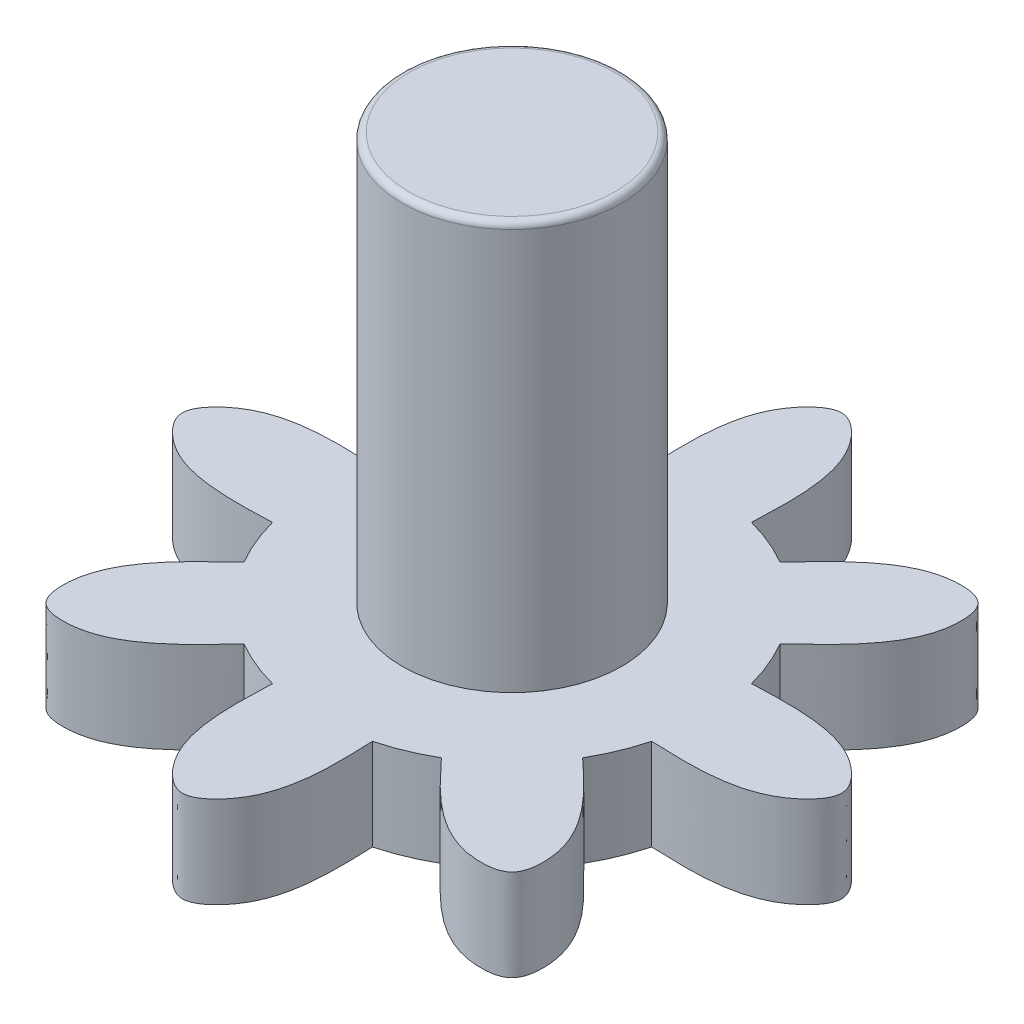
ISO-10303-21;
HEADER;
FILE_DESCRIPTION(('STEP AP214'),'2;1');
FILE_NAME('part.step','',(''),(''),'','','');
FILE_SCHEMA(('AUTOMOTIVE_DESIGN { 1 0 10303 214 1 1 1 1 }'));
ENDSEC;
DATA;
#1=APPLICATION_CONTEXT('core data for automotive mechanical design processes');
#2=APPLICATION_PROTOCOL_DEFINITION('international standard','automotive_design',2000,#1);
#3=PRODUCT_CONTEXT('',#1,'mechanical');
#4=PRODUCT('Part','Part','',(#3));
#5=PRODUCT_RELATED_PRODUCT_CATEGORY('part','',(#4));
#6=PRODUCT_DEFINITION_FORMATION('','',#4);
#7=PRODUCT_DEFINITION_CONTEXT('part definition',#1,'design');
#8=PRODUCT_DEFINITION('design','',#6,#7);
#9=PRODUCT_DEFINITION_SHAPE('','',#8);
#10=(LENGTH_UNIT() NAMED_UNIT(*) SI_UNIT(.MILLI.,.METRE.));
#11=(NAMED_UNIT(*) PLANE_ANGLE_UNIT() SI_UNIT($,.RADIAN.));
#12=(NAMED_UNIT(*) SI_UNIT($,.STERADIAN.) SOLID_ANGLE_UNIT());
#13=UNCERTAINTY_MEASURE_WITH_UNIT(LENGTH_MEASURE(1.E-05),#10,'distance_accuracy_value','');
#14=(GEOMETRIC_REPRESENTATION_CONTEXT(3) GLOBAL_UNCERTAINTY_ASSIGNED_CONTEXT((#13)) GLOBAL_UNIT_ASSIGNED_CONTEXT((#10,
#11,#12)) REPRESENTATION_CONTEXT('',''));
#15=CARTESIAN_POINT('',(0.,0.,0.));
#16=DIRECTION('',(0.,0.,1.));
#17=DIRECTION('',(1.,0.,0.));
#18=AXIS2_PLACEMENT_3D('',#15,#16,#17);
#19=CARTESIAN_POINT('',(0.,2.75,0.));
#20=DIRECTION('',(0.,-1.,0.));
#21=DIRECTION('',(0.,0.,-1.));
#22=AXIS2_PLACEMENT_3D('',#19,#20,#21);
#23=CYLINDRICAL_SURFACE('',#22,5.89);
#24=DIRECTION('',(0.,-1.,0.));
#25=VECTOR('',#24,1.);
#26=CARTESIAN_POINT('',(5.08831548219907,2.75,-2.96667247157707));
#27=LINE('',#26,#25);
#28=CARTESIAN_POINT('',(5.08831548219908,2.75,-2.96667247157706));
#29=VERTEX_POINT('',#28);
#30=CARTESIAN_POINT('',(5.08831548219908,0.,-2.96667247157706));
#31=VERTEX_POINT('',#30);
#32=EDGE_CURVE('E63',#29,#31,#27,.T.);
#33=ORIENTED_EDGE('',*,*,#32,.F.);
#34=CARTESIAN_POINT('',(0.,2.75,0.));
#35=DIRECTION('',(0.,1.,0.));
#36=DIRECTION('',(0.,0.,1.));
#37=AXIS2_PLACEMENT_3D('',#34,#35,#36);
#38=CIRCLE('',#37,5.89);
#39=CARTESIAN_POINT('',(5.69573660449103,2.75,-1.50022816006798));
#40=VERTEX_POINT('',#39);
#41=EDGE_CURVE('E399',#40,#29,#38,.T.);
#42=ORIENTED_EDGE('',*,*,#41,.F.);
#43=DIRECTION('',(0.,-1.,0.));
#44=VECTOR('',#43,1.);
#45=CARTESIAN_POINT('',(5.69573660449103,2.75,-1.50022816006798));
#46=LINE('',#45,#44);
#47=CARTESIAN_POINT('',(5.69573660449103,0.,-1.50022816006798));
#48=VERTEX_POINT('',#47);
#49=EDGE_CURVE('E192',#48,#40,#46,.F.);
#50=ORIENTED_EDGE('',*,*,#49,.F.);
#51=CARTESIAN_POINT('',(0.,0.,0.));
#52=DIRECTION('',(0.,1.,0.));
#53=DIRECTION('',(0.,0.,1.));
#54=AXIS2_PLACEMENT_3D('',#51,#52,#53);
#55=CIRCLE('',#54,5.89);
#56=EDGE_CURVE('E161',#48,#31,#55,.T.);
#57=ORIENTED_EDGE('',*,*,#56,.T.);
#58=EDGE_LOOP('',(#33,#42,#50,#57));
#59=FACE_BOUND('',#58,.T.);
#60=ADVANCED_FACE('F40',(#59),#23,.T.);
#61=DIRECTION('',(0.,-1.,0.));
#62=VECTOR('',#61,1.);
#63=CARTESIAN_POINT('',(2.96667247157695,2.75,-5.08831548219914));
#64=LINE('',#63,#62);
#65=CARTESIAN_POINT('',(2.96667247157695,0.,-5.08831548219914));
#66=VERTEX_POINT('',#65);
#67=CARTESIAN_POINT('',(2.96667247157695,2.75,-5.08831548219914));
#68=VERTEX_POINT('',#67);
#69=EDGE_CURVE('E165',#66,#68,#64,.F.);
#70=ORIENTED_EDGE('',*,*,#69,.F.);
#71=CARTESIAN_POINT('',(1.50022816006792,0.,-5.69573660449105));
#72=VERTEX_POINT('',#71);
#73=EDGE_CURVE('E154',#66,#72,#55,.T.);
#74=ORIENTED_EDGE('',*,*,#73,.T.);
#75=DIRECTION('',(0.,-1.,0.));
#76=VECTOR('',#75,1.);
#77=CARTESIAN_POINT('',(1.50022816006792,2.75,-5.69573660449105));
#78=LINE('',#77,#76);
#79=CARTESIAN_POINT('',(1.50022816006792,2.75,-5.69573660449105));
#80=VERTEX_POINT('',#79);
#81=EDGE_CURVE('E162',#80,#72,#78,.T.);
#82=ORIENTED_EDGE('',*,*,#81,.F.);
#83=EDGE_CURVE('E55',#68,#80,#38,.T.);
#84=ORIENTED_EDGE('',*,*,#83,.F.);
#85=EDGE_LOOP('',(#70,#74,#82,#84));
#86=FACE_BOUND('',#85,.T.);
#87=ADVANCED_FACE('F166',(#86),#23,.T.);
#88=DIRECTION('',(0.,-1.,0.));
#89=VECTOR('',#88,1.);
#90=CARTESIAN_POINT('',(5.69573660449106,2.75,1.50022816006786));
#91=LINE('',#90,#89);
#92=CARTESIAN_POINT('',(5.69573660449106,2.75,1.50022816006786));
#93=VERTEX_POINT('',#92);
#94=CARTESIAN_POINT('',(5.69573660449106,0.,1.50022816006786));
#95=VERTEX_POINT('',#94);
#96=EDGE_CURVE('E222',#93,#95,#91,.T.);
#97=ORIENTED_EDGE('',*,*,#96,.F.);
#98=CARTESIAN_POINT('',(5.08831548219913,2.75,2.96667247157697));
#99=VERTEX_POINT('',#98);
#100=EDGE_CURVE('E390',#99,#93,#38,.T.);
#101=ORIENTED_EDGE('',*,*,#100,.F.);
#102=DIRECTION('',(0.,-1.,0.));
#103=VECTOR('',#102,1.);
#104=CARTESIAN_POINT('',(5.08831548219913,2.75,2.96667247157697));
#105=LINE('',#104,#103);
#106=CARTESIAN_POINT('',(5.08831548219914,0.,2.96667247157697));
#107=VERTEX_POINT('',#106);
#108=EDGE_CURVE('E220',#107,#99,#105,.F.);
#109=ORIENTED_EDGE('',*,*,#108,.F.);
#110=EDGE_CURVE('E391',#107,#95,#55,.T.);
#111=ORIENTED_EDGE('',*,*,#110,.T.);
#112=EDGE_LOOP('',(#97,#101,#109,#111));
#113=FACE_BOUND('',#112,.T.);
#114=ADVANCED_FACE('F376',(#113),#23,.T.);
#115=DIRECTION('',(0.,-1.,0.));
#116=VECTOR('',#115,1.);
#117=CARTESIAN_POINT('',(2.96667247157706,2.75,5.08831548219908));
#118=LINE('',#117,#116);
#119=CARTESIAN_POINT('',(2.96667247157704,2.75,5.08831548219909));
#120=VERTEX_POINT('',#119);
#121=CARTESIAN_POINT('',(2.96667247157704,0.,5.08831548219909));
#122=VERTEX_POINT('',#121);
#123=EDGE_CURVE('E235',#120,#122,#118,.T.);
#124=ORIENTED_EDGE('',*,*,#123,.F.);
#125=CARTESIAN_POINT('',(1.50022816006792,2.75,5.69573660449105));
#126=VERTEX_POINT('',#125);
#127=EDGE_CURVE('E398',#126,#120,#38,.T.);
#128=ORIENTED_EDGE('',*,*,#127,.F.);
#129=DIRECTION('',(0.,-1.,0.));
#130=VECTOR('',#129,1.);
#131=CARTESIAN_POINT('',(1.50022816006792,2.75,5.69573660449105));
#132=LINE('',#131,#130);
#133=CARTESIAN_POINT('',(1.50022816006792,0.,5.69573660449105));
#134=VERTEX_POINT('',#133);
#135=EDGE_CURVE('E244',#134,#126,#132,.F.);
#136=ORIENTED_EDGE('',*,*,#135,.F.);
#137=EDGE_CURVE('E451',#134,#122,#55,.T.);
#138=ORIENTED_EDGE('',*,*,#137,.T.);
#139=EDGE_LOOP('',(#124,#128,#136,#138));
#140=FACE_BOUND('',#139,.T.);
#141=ADVANCED_FACE('F380',(#140),#23,.T.);
#142=DIRECTION('',(0.,-1.,0.));
#143=VECTOR('',#142,1.);
#144=CARTESIAN_POINT('',(-1.50022816006792,2.75,5.69573660449105));
#145=LINE('',#144,#143);
#146=CARTESIAN_POINT('',(-1.50022816006792,2.75,5.69573660449105));
#147=VERTEX_POINT('',#146);
#148=CARTESIAN_POINT('',(-1.50022816006792,0.,5.69573660449105));
#149=VERTEX_POINT('',#148);
#150=EDGE_CURVE('E257',#147,#149,#145,.T.);
#151=ORIENTED_EDGE('',*,*,#150,.F.);
#152=CARTESIAN_POINT('',(-2.96667247157699,2.75,5.08831548219912));
#153=VERTEX_POINT('',#152);
#154=EDGE_CURVE('E444',#153,#147,#38,.T.);
#155=ORIENTED_EDGE('',*,*,#154,.F.);
#156=DIRECTION('',(0.,-1.,0.));
#157=VECTOR('',#156,1.);
#158=CARTESIAN_POINT('',(-2.96667247157699,2.75,5.08831548219912));
#159=LINE('',#158,#157);
#160=CARTESIAN_POINT('',(-2.96667247157699,0.,5.08831548219912));
#161=VERTEX_POINT('',#160);
#162=EDGE_CURVE('E267',#161,#153,#159,.F.);
#163=ORIENTED_EDGE('',*,*,#162,.F.);
#164=EDGE_CURVE('E452',#161,#149,#55,.T.);
#165=ORIENTED_EDGE('',*,*,#164,.T.);
#166=EDGE_LOOP('',(#151,#155,#163,#165));
#167=FACE_BOUND('',#166,.T.);
#168=ADVANCED_FACE('F385',(#167),#23,.T.);
#169=DIRECTION('',(0.,-1.,0.));
#170=VECTOR('',#169,1.);
#171=CARTESIAN_POINT('',(-5.08831548219909,2.75,2.96667247157704));
#172=LINE('',#171,#170);
#173=CARTESIAN_POINT('',(-5.0883154821991,2.75,2.96667247157702));
#174=VERTEX_POINT('',#173);
#175=CARTESIAN_POINT('',(-5.0883154821991,0.,2.96667247157702));
#176=VERTEX_POINT('',#175);
#177=EDGE_CURVE('E295',#174,#176,#172,.T.);
#178=ORIENTED_EDGE('',*,*,#177,.F.);
#179=CARTESIAN_POINT('',(-5.69573660449104,2.75,1.50022816006794));
#180=VERTEX_POINT('',#179);
#181=EDGE_CURVE('E442',#180,#174,#38,.T.);
#182=ORIENTED_EDGE('',*,*,#181,.F.);
#183=DIRECTION('',(0.,-1.,0.));
#184=VECTOR('',#183,1.);
#185=CARTESIAN_POINT('',(-5.69573660449104,2.75,1.50022816006794));
#186=LINE('',#185,#184);
#187=CARTESIAN_POINT('',(-5.69573660449104,0.,1.50022816006794));
#188=VERTEX_POINT('',#187);
#189=EDGE_CURVE('E293',#188,#180,#186,.F.);
#190=ORIENTED_EDGE('',*,*,#189,.F.);
#191=EDGE_CURVE('E441',#188,#176,#55,.T.);
#192=ORIENTED_EDGE('',*,*,#191,.T.);
#193=EDGE_LOOP('',(#178,#182,#190,#192));
#194=FACE_BOUND('',#193,.T.);
#195=ADVANCED_FACE('F370',(#194),#23,.T.);
#196=DIRECTION('',(0.,-1.,0.));
#197=VECTOR('',#196,1.);
#198=CARTESIAN_POINT('',(-5.69573660449105,2.75,-1.5002281600679));
#199=LINE('',#198,#197);
#200=CARTESIAN_POINT('',(-5.69573660449105,2.75,-1.50022816006793));
#201=VERTEX_POINT('',#200);
#202=CARTESIAN_POINT('',(-5.69573660449105,0.,-1.50022816006793));
#203=VERTEX_POINT('',#202);
#204=EDGE_CURVE('E308',#201,#203,#199,.T.);
#205=ORIENTED_EDGE('',*,*,#204,.F.);
#206=CARTESIAN_POINT('',(-5.08831548219911,2.75,-2.96667247157701));
#207=VERTEX_POINT('',#206);
#208=EDGE_CURVE('E405',#207,#201,#38,.T.);
#209=ORIENTED_EDGE('',*,*,#208,.F.);
#210=DIRECTION('',(0.,-1.,0.));
#211=VECTOR('',#210,1.);
#212=CARTESIAN_POINT('',(-5.08831548219911,2.75,-2.96667247157701));
#213=LINE('',#212,#211);
#214=CARTESIAN_POINT('',(-5.08831548219911,0.,-2.96667247157701));
#215=VERTEX_POINT('',#214);
#216=EDGE_CURVE('E317',#215,#207,#213,.F.);
#217=ORIENTED_EDGE('',*,*,#216,.F.);
#218=EDGE_CURVE('E406',#215,#203,#55,.T.);
#219=ORIENTED_EDGE('',*,*,#218,.T.);
#220=EDGE_LOOP('',(#205,#209,#217,#219));
#221=FACE_BOUND('',#220,.T.);
#222=ADVANCED_FACE('F364',(#221),#23,.T.);
#223=DIRECTION('',(0.,-1.,0.));
#224=VECTOR('',#223,1.);
#225=CARTESIAN_POINT('',(-2.96667247157702,2.75,-5.0883154821991));
#226=LINE('',#225,#224);
#227=CARTESIAN_POINT('',(-2.96667247157702,2.75,-5.0883154821991));
#228=VERTEX_POINT('',#227);
#229=CARTESIAN_POINT('',(-2.96667247157702,0.,-5.0883154821991));
#230=VERTEX_POINT('',#229);
#231=EDGE_CURVE('E330',#228,#230,#226,.T.);
#232=ORIENTED_EDGE('',*,*,#231,.F.);
#233=CARTESIAN_POINT('',(-1.50022816006792,2.75,-5.69573660449105));
#234=VERTEX_POINT('',#233);
#235=EDGE_CURVE('E336',#234,#228,#38,.T.);
#236=ORIENTED_EDGE('',*,*,#235,.F.);
#237=DIRECTION('',(0.,-1.,0.));
#238=VECTOR('',#237,1.);
#239=CARTESIAN_POINT('',(-1.50022816006792,2.75,-5.69573660449105));
#240=LINE('',#239,#238);
#241=CARTESIAN_POINT('',(-1.50022816006792,0.,-5.69573660449105));
#242=VERTEX_POINT('',#241);
#243=EDGE_CURVE('E343',#242,#234,#240,.F.);
#244=ORIENTED_EDGE('',*,*,#243,.F.);
#245=EDGE_CURVE('E164',#242,#230,#55,.T.);
#246=ORIENTED_EDGE('',*,*,#245,.T.);
#247=EDGE_LOOP('',(#232,#236,#244,#246));
#248=FACE_BOUND('',#247,.T.);
#249=ADVANCED_FACE('F360',(#248),#23,.T.);
#250=CARTESIAN_POINT('',(0.,2.75,0.));
#251=DIRECTION('',(0.,1.,0.));
#252=DIRECTION('',(0.,0.,1.));
#253=AXIS2_PLACEMENT_3D('',#250,#251,#252);
#254=PLANE('',#253);
#255=ORIENTED_EDGE('',*,*,#41,.T.);
#256=CARTESIAN_POINT('',(5.08409775673124,2.75,-2.9627774131717));
#257=CARTESIAN_POINT('',(5.49968944174929,2.75,-3.34657489327147));
#258=CARTESIAN_POINT('',(6.46693464253058,2.75,-4.23982248238612));
#259=CARTESIAN_POINT('',(7.33984910029191,2.75,-5.64560569758025));
#260=CARTESIAN_POINT('',(7.13398158934485,2.75,-7.13398158934502));
#261=CARTESIAN_POINT('',(5.64560569758007,2.75,-7.33984910029205));
#262=CARTESIAN_POINT('',(4.23982248238596,2.75,-6.46693464253068));
#263=CARTESIAN_POINT('',(3.34657489327134,2.75,-5.49968944174937));
#264=CARTESIAN_POINT('',(2.96277741317157,2.75,-5.08409775673131));
#265=B_SPLINE_CURVE_WITH_KNOTS('',3,(#256,#257,#258,#259,#260,#261,#262,#263,#264),
.UNSPECIFIED.,.F.,.F.,(4,1,1,1,1,1,4),(0.,0.178466674419104,0.415362098314794,0.5,
0.584637901685206,0.821533325580896,1.),.UNSPECIFIED.);
#266=EDGE_CURVE('E170',#29,#68,#265,.T.);
#267=ORIENTED_EDGE('',*,*,#266,.T.);
#268=ORIENTED_EDGE('',*,*,#83,.T.);
#269=CARTESIAN_POINT('',(1.5,2.75,-5.69));
#270=CARTESIAN_POINT('',(1.52248189790015,2.75,-6.25525349946186));
#271=CARTESIAN_POINT('',(1.57480611090126,2.75,-7.57082056754596));
#272=CARTESIAN_POINT('',(1.1980109990381,2.75,-9.18210314436678));
#273=CARTESIAN_POINT('',(0.,2.75,-10.0889735173716));
#274=CARTESIAN_POINT('',(-1.1980109990381,2.75,-9.18210314436678));
#275=CARTESIAN_POINT('',(-1.57480611090126,2.75,-7.57082056754596));
#276=CARTESIAN_POINT('',(-1.52248189790015,2.75,-6.25525349946186));
#277=CARTESIAN_POINT('',(-1.5,2.75,-5.69));
#278=B_SPLINE_CURVE_WITH_KNOTS('',3,(#269,#270,#271,#272,#273,#274,#275,#276,#277),
.UNSPECIFIED.,.F.,.F.,(4,1,1,1,1,1,4),(0.,0.178466674419104,0.415362098314794,0.5,
0.584637901685206,0.821533325580896,1.),.UNSPECIFIED.);
#279=EDGE_CURVE('E337',#80,#234,#278,.T.);
#280=ORIENTED_EDGE('',*,*,#279,.T.);
#281=ORIENTED_EDGE('',*,*,#235,.T.);
#282=CARTESIAN_POINT('',(-2.96277741317164,2.75,-5.08409775673127));
#283=CARTESIAN_POINT('',(-3.34657489327141,2.75,-5.49968944174932));
#284=CARTESIAN_POINT('',(-4.23982248238605,2.75,-6.46693464253062));
#285=CARTESIAN_POINT('',(-5.64560569758017,2.75,-7.33984910029197));
#286=CARTESIAN_POINT('',(-7.13398158934495,2.75,-7.13398158934492));
#287=CARTESIAN_POINT('',(-7.33984910029199,2.75,-5.64560569758015));
#288=CARTESIAN_POINT('',(-6.46693464253064,2.75,-4.23982248238602));
#289=CARTESIAN_POINT('',(-5.49968944174933,2.75,-3.3465748932714));
#290=CARTESIAN_POINT('',(-5.08409775673128,2.75,-2.96277741317162));
#291=B_SPLINE_CURVE_WITH_KNOTS('',3,(#282,#283,#284,#285,#286,#287,#288,#289,#290),
.UNSPECIFIED.,.F.,.F.,(4,1,1,1,1,1,4),(0.,0.178466674419104,0.415362098314794,0.5,
0.584637901685206,0.821533325580896,1.),.UNSPECIFIED.);
#292=EDGE_CURVE('E311',#228,#207,#291,.T.);
#293=ORIENTED_EDGE('',*,*,#292,.T.);
#294=ORIENTED_EDGE('',*,*,#208,.T.);
#295=CARTESIAN_POINT('',(-5.69,2.75,-1.49999999999998));
#296=CARTESIAN_POINT('',(-6.25525349946187,2.75,-1.52248189790013));
#297=CARTESIAN_POINT('',(-7.57082056754597,2.75,-1.57480611090124));
#298=CARTESIAN_POINT('',(-9.18210314436678,2.75,-1.19801099903807));
#299=CARTESIAN_POINT('',(-10.0889735173716,2.75,0.));
#300=CARTESIAN_POINT('',(-9.18210314436678,2.75,1.19801099903813));
#301=CARTESIAN_POINT('',(-7.57082056754595,2.75,1.57480611090129));
#302=CARTESIAN_POINT('',(-6.25525349946186,2.75,1.52248189790017));
#303=CARTESIAN_POINT('',(-5.68999999999999,2.75,1.50000000000002));
#304=B_SPLINE_CURVE_WITH_KNOTS('',3,(#295,#296,#297,#298,#299,#300,#301,#302,#303),
.UNSPECIFIED.,.F.,.F.,(4,1,1,1,1,1,4),(0.,0.178466674419104,0.415362098314794,0.5,
0.584637901685206,0.821533325580896,1.),.UNSPECIFIED.);
#305=EDGE_CURVE('E286',#201,#180,#304,.T.);
#306=ORIENTED_EDGE('',*,*,#305,.T.);
#307=ORIENTED_EDGE('',*,*,#181,.T.);
#308=CARTESIAN_POINT('',(-5.08409775673126,2.75,2.96277741317166));
#309=CARTESIAN_POINT('',(-5.49968944174931,2.75,3.34657489327143));
#310=CARTESIAN_POINT('',(-6.46693464253061,2.75,4.23982248238607));
#311=CARTESIAN_POINT('',(-7.33984910029195,2.75,5.6456056975802));
#312=CARTESIAN_POINT('',(-7.1339815893449,2.75,7.13398158934497));
#313=CARTESIAN_POINT('',(-5.64560569758012,2.75,7.33984910029201));
#314=CARTESIAN_POINT('',(-4.239822482386,2.75,6.46693464253065));
#315=CARTESIAN_POINT('',(-3.34657489327138,2.75,5.49968944174934));
#316=CARTESIAN_POINT('',(-2.96277741317161,2.75,5.08409775673129));
#317=B_SPLINE_CURVE_WITH_KNOTS('',3,(#308,#309,#310,#311,#312,#313,#314,#315,#316),
.UNSPECIFIED.,.F.,.F.,(4,1,1,1,1,1,4),(0.,0.178466674419104,0.415362098314794,0.5,
0.584637901685206,0.821533325580896,1.),.UNSPECIFIED.);
#318=EDGE_CURVE('E261',#174,#153,#317,.T.);
#319=ORIENTED_EDGE('',*,*,#318,.T.);
#320=ORIENTED_EDGE('',*,*,#154,.T.);
#321=CARTESIAN_POINT('',(-1.5,2.75,5.69));
#322=CARTESIAN_POINT('',(-1.52248189790015,2.75,6.25525349946186));
#323=CARTESIAN_POINT('',(-1.57480611090126,2.75,7.57082056754596));
#324=CARTESIAN_POINT('',(-1.1980109990381,2.75,9.18210314436678));
#325=CARTESIAN_POINT('',(0.,2.75,10.0889735173716));
#326=CARTESIAN_POINT('',(1.1980109990381,2.75,9.18210314436678));
#327=CARTESIAN_POINT('',(1.57480611090126,2.75,7.57082056754596));
#328=CARTESIAN_POINT('',(1.52248189790015,2.75,6.25525349946186));
#329=CARTESIAN_POINT('',(1.5,2.75,5.69));
#330=B_SPLINE_CURVE_WITH_KNOTS('',3,(#321,#322,#323,#324,#325,#326,#327,#328,#329),
.UNSPECIFIED.,.F.,.F.,(4,1,1,1,1,1,4),(0.,0.178466674419104,0.415362098314794,0.5,
0.584637901685206,0.821533325580896,1.),.UNSPECIFIED.);
#331=EDGE_CURVE('E238',#147,#126,#330,.T.);
#332=ORIENTED_EDGE('',*,*,#331,.T.);
#333=ORIENTED_EDGE('',*,*,#127,.T.);
#334=CARTESIAN_POINT('',(2.96277741317168,2.75,5.08409775673125));
#335=CARTESIAN_POINT('',(3.34657489327145,2.75,5.4996894417493));
#336=CARTESIAN_POINT('',(4.2398224823861,2.75,6.46693464253059));
#337=CARTESIAN_POINT('',(5.64560569758023,2.75,7.33984910029193));
#338=CARTESIAN_POINT('',(7.133981589345,2.75,7.13398158934487));
#339=CARTESIAN_POINT('',(7.33984910029203,2.75,5.6456056975801));
#340=CARTESIAN_POINT('',(6.46693464253066,2.75,4.23982248238598));
#341=CARTESIAN_POINT('',(5.49968944174936,2.75,3.34657489327136));
#342=CARTESIAN_POINT('',(5.0840977567313,2.75,2.96277741317159));
#343=B_SPLINE_CURVE_WITH_KNOTS('',3,(#334,#335,#336,#337,#338,#339,#340,#341,#342),
.UNSPECIFIED.,.F.,.F.,(4,1,1,1,1,1,4),(0.,0.178466674419104,0.415362098314794,0.5,
0.584637901685206,0.821533325580896,1.),.UNSPECIFIED.);
#344=EDGE_CURVE('E213',#120,#99,#343,.T.);
#345=ORIENTED_EDGE('',*,*,#344,.T.);
#346=ORIENTED_EDGE('',*,*,#100,.T.);
#347=CARTESIAN_POINT('',(5.69000000000001,2.75,1.49999999999994));
#348=CARTESIAN_POINT('',(6.25525349946188,2.75,1.52248189790008));
#349=CARTESIAN_POINT('',(7.57082056754598,2.75,1.57480611090118));
#350=CARTESIAN_POINT('',(9.18210314436679,2.75,1.198010999038));
#351=CARTESIAN_POINT('',(10.0889735173716,2.75,-1.05856411486558E-13));
#352=CARTESIAN_POINT('',(9.18210314436677,2.75,-1.1980109990382));
#353=CARTESIAN_POINT('',(7.57082056754594,2.75,-1.57480611090134));
#354=CARTESIAN_POINT('',(6.25525349946185,2.75,-1.52248189790022));
#355=CARTESIAN_POINT('',(5.68999999999998,2.75,-1.50000000000006));
#356=B_SPLINE_CURVE_WITH_KNOTS('',3,(#347,#348,#349,#350,#351,#352,#353,#354,#355),
.UNSPECIFIED.,.F.,.F.,(4,1,1,1,1,1,4),(0.,0.178466674419104,0.415362098314794,0.5,
0.584637901685206,0.821533325580896,1.),.UNSPECIFIED.);
#357=EDGE_CURVE('E186',#93,#40,#356,.T.);
#358=ORIENTED_EDGE('',*,*,#357,.T.);
#359=EDGE_LOOP('',(#255,#267,#268,#280,#281,#293,#294,#306,#307,#319,#320,#332,#333,#345,#346,#358));
#360=FACE_BOUND('',#359,.T.);
#361=CARTESIAN_POINT('',(0.,2.75,0.));
#362=DIRECTION('',(0.,1.,0.));
#363=DIRECTION('',(0.,0.,1.));
#364=AXIS2_PLACEMENT_3D('',#361,#362,#363);
#365=CIRCLE('',#364,3.3);
#366=CARTESIAN_POINT('',(0.,2.75,3.3));
#367=VERTEX_POINT('',#366);
#368=EDGE_CURVE('E333',#367,#367,#365,.T.);
#369=ORIENTED_EDGE('',*,*,#368,.F.);
#370=EDGE_LOOP('',(#369));
#371=FACE_BOUND('',#370,.T.);
#372=ADVANCED_FACE('F357',(#360,#371),#254,.T.);
#373=CARTESIAN_POINT('',(0.,0.,0.));
#374=DIRECTION('',(0.,1.,0.));
#375=DIRECTION('',(0.,0.,1.));
#376=AXIS2_PLACEMENT_3D('',#373,#374,#375);
#377=PLANE('',#376);
#378=ORIENTED_EDGE('',*,*,#73,.F.);
#379=CARTESIAN_POINT('',(5.08409775673124,0.,-2.9627774131717));
#380=CARTESIAN_POINT('',(5.49968944174929,0.,-3.34657489327147));
#381=CARTESIAN_POINT('',(6.46693464253058,0.,-4.23982248238612));
#382=CARTESIAN_POINT('',(7.33984910029191,0.,-5.64560569758025));
#383=CARTESIAN_POINT('',(7.13398158934485,0.,-7.13398158934502));
#384=CARTESIAN_POINT('',(5.64560569758007,0.,-7.33984910029205));
#385=CARTESIAN_POINT('',(4.23982248238596,0.,-6.46693464253068));
#386=CARTESIAN_POINT('',(3.34657489327134,0.,-5.49968944174937));
#387=CARTESIAN_POINT('',(2.96277741317157,0.,-5.08409775673131));
#388=B_SPLINE_CURVE_WITH_KNOTS('',3,(#379,#380,#381,#382,#383,#384,#385,#386,#387),
.UNSPECIFIED.,.F.,.F.,(4,1,1,1,1,1,4),(0.,0.178466674419104,0.415362098314794,0.5,
0.584637901685206,0.821533325580896,1.),.UNSPECIFIED.);
#389=EDGE_CURVE('E157',#31,#66,#388,.T.);
#390=ORIENTED_EDGE('',*,*,#389,.F.);
#391=ORIENTED_EDGE('',*,*,#56,.F.);
#392=CARTESIAN_POINT('',(5.69000000000001,0.,1.49999999999994));
#393=CARTESIAN_POINT('',(6.25525349946188,0.,1.52248189790008));
#394=CARTESIAN_POINT('',(7.57082056754598,0.,1.57480611090118));
#395=CARTESIAN_POINT('',(9.18210314436679,0.,1.198010999038));
#396=CARTESIAN_POINT('',(10.0889735173716,0.,-1.05856411486558E-13));
#397=CARTESIAN_POINT('',(9.18210314436677,0.,-1.1980109990382));
#398=CARTESIAN_POINT('',(7.57082056754594,0.,-1.57480611090134));
#399=CARTESIAN_POINT('',(6.25525349946185,0.,-1.52248189790022));
#400=CARTESIAN_POINT('',(5.68999999999998,0.,-1.50000000000006));
#401=B_SPLINE_CURVE_WITH_KNOTS('',3,(#392,#393,#394,#395,#396,#397,#398,#399,#400),
.UNSPECIFIED.,.F.,.F.,(4,1,1,1,1,1,4),(0.,0.178466674419104,0.415362098314794,0.5,
0.584637901685206,0.821533325580896,1.),.UNSPECIFIED.);
#402=EDGE_CURVE('E185',#95,#48,#401,.T.);
#403=ORIENTED_EDGE('',*,*,#402,.F.);
#404=ORIENTED_EDGE('',*,*,#110,.F.);
#405=CARTESIAN_POINT('',(2.96277741317168,0.,5.08409775673125));
#406=CARTESIAN_POINT('',(3.34657489327145,0.,5.4996894417493));
#407=CARTESIAN_POINT('',(4.2398224823861,0.,6.46693464253059));
#408=CARTESIAN_POINT('',(5.64560569758023,0.,7.33984910029193));
#409=CARTESIAN_POINT('',(7.133981589345,0.,7.13398158934487));
#410=CARTESIAN_POINT('',(7.33984910029203,0.,5.6456056975801));
#411=CARTESIAN_POINT('',(6.46693464253066,0.,4.23982248238598));
#412=CARTESIAN_POINT('',(5.49968944174936,0.,3.34657489327136));
#413=CARTESIAN_POINT('',(5.0840977567313,0.,2.96277741317159));
#414=B_SPLINE_CURVE_WITH_KNOTS('',3,(#405,#406,#407,#408,#409,#410,#411,#412,#413),
.UNSPECIFIED.,.F.,.F.,(4,1,1,1,1,1,4),(0.,0.178466674419104,0.415362098314794,0.5,
0.584637901685206,0.821533325580896,1.),.UNSPECIFIED.);
#415=EDGE_CURVE('E221',#122,#107,#414,.T.);
#416=ORIENTED_EDGE('',*,*,#415,.F.);
#417=ORIENTED_EDGE('',*,*,#137,.F.);
#418=CARTESIAN_POINT('',(-1.5,0.,5.69));
#419=CARTESIAN_POINT('',(-1.52248189790015,0.,6.25525349946186));
#420=CARTESIAN_POINT('',(-1.57480611090126,0.,7.57082056754596));
#421=CARTESIAN_POINT('',(-1.1980109990381,0.,9.18210314436678));
#422=CARTESIAN_POINT('',(0.,0.,10.0889735173716));
#423=CARTESIAN_POINT('',(1.1980109990381,0.,9.18210314436678));
#424=CARTESIAN_POINT('',(1.57480611090126,0.,7.57082056754596));
#425=CARTESIAN_POINT('',(1.52248189790015,0.,6.25525349946186));
#426=CARTESIAN_POINT('',(1.5,0.,5.69));
#427=B_SPLINE_CURVE_WITH_KNOTS('',3,(#418,#419,#420,#421,#422,#423,#424,#425,#426),
.UNSPECIFIED.,.F.,.F.,(4,1,1,1,1,1,4),(0.,0.178466674419104,0.415362098314794,0.5,
0.584637901685206,0.821533325580896,1.),.UNSPECIFIED.);
#428=EDGE_CURVE('E237',#149,#134,#427,.T.);
#429=ORIENTED_EDGE('',*,*,#428,.F.);
#430=ORIENTED_EDGE('',*,*,#164,.F.);
#431=CARTESIAN_POINT('',(-5.08409775673126,0.,2.96277741317166));
#432=CARTESIAN_POINT('',(-5.49968944174931,0.,3.34657489327143));
#433=CARTESIAN_POINT('',(-6.46693464253061,0.,4.23982248238607));
#434=CARTESIAN_POINT('',(-7.33984910029195,0.,5.6456056975802));
#435=CARTESIAN_POINT('',(-7.1339815893449,0.,7.13398158934497));
#436=CARTESIAN_POINT('',(-5.64560569758012,0.,7.33984910029201));
#437=CARTESIAN_POINT('',(-4.239822482386,0.,6.46693464253065));
#438=CARTESIAN_POINT('',(-3.34657489327138,0.,5.49968944174934));
#439=CARTESIAN_POINT('',(-2.96277741317161,0.,5.08409775673129));
#440=B_SPLINE_CURVE_WITH_KNOTS('',3,(#431,#432,#433,#434,#435,#436,#437,#438,#439),
.UNSPECIFIED.,.F.,.F.,(4,1,1,1,1,1,4),(0.,0.178466674419104,0.415362098314794,0.5,
0.584637901685206,0.821533325580896,1.),.UNSPECIFIED.);
#441=EDGE_CURVE('E260',#176,#161,#440,.T.);
#442=ORIENTED_EDGE('',*,*,#441,.F.);
#443=ORIENTED_EDGE('',*,*,#191,.F.);
#444=CARTESIAN_POINT('',(-5.69,0.,-1.49999999999998));
#445=CARTESIAN_POINT('',(-6.25525349946187,0.,-1.52248189790013));
#446=CARTESIAN_POINT('',(-7.57082056754597,0.,-1.57480611090124));
#447=CARTESIAN_POINT('',(-9.18210314436678,0.,-1.19801099903807));
#448=CARTESIAN_POINT('',(-10.0889735173716,0.,0.));
#449=CARTESIAN_POINT('',(-9.18210314436678,0.,1.19801099903813));
#450=CARTESIAN_POINT('',(-7.57082056754595,0.,1.57480611090129));
#451=CARTESIAN_POINT('',(-6.25525349946186,0.,1.52248189790017));
#452=CARTESIAN_POINT('',(-5.68999999999999,0.,1.50000000000002));
#453=B_SPLINE_CURVE_WITH_KNOTS('',3,(#444,#445,#446,#447,#448,#449,#450,#451,#452),
.UNSPECIFIED.,.F.,.F.,(4,1,1,1,1,1,4),(0.,0.178466674419104,0.415362098314794,0.5,
0.584637901685206,0.821533325580896,1.),.UNSPECIFIED.);
#454=EDGE_CURVE('E294',#203,#188,#453,.T.);
#455=ORIENTED_EDGE('',*,*,#454,.F.);
#456=ORIENTED_EDGE('',*,*,#218,.F.);
#457=CARTESIAN_POINT('',(-2.96277741317164,0.,-5.08409775673127));
#458=CARTESIAN_POINT('',(-3.34657489327141,0.,-5.49968944174932));
#459=CARTESIAN_POINT('',(-4.23982248238605,0.,-6.46693464253062));
#460=CARTESIAN_POINT('',(-5.64560569758017,0.,-7.33984910029197));
#461=CARTESIAN_POINT('',(-7.13398158934495,0.,-7.13398158934492));
#462=CARTESIAN_POINT('',(-7.33984910029199,0.,-5.64560569758015));
#463=CARTESIAN_POINT('',(-6.46693464253064,0.,-4.23982248238602));
#464=CARTESIAN_POINT('',(-5.49968944174933,0.,-3.3465748932714));
#465=CARTESIAN_POINT('',(-5.08409775673128,0.,-2.96277741317162));
#466=B_SPLINE_CURVE_WITH_KNOTS('',3,(#457,#458,#459,#460,#461,#462,#463,#464,#465),
.UNSPECIFIED.,.F.,.F.,(4,1,1,1,1,1,4),(0.,0.178466674419104,0.415362098314794,0.5,
0.584637901685206,0.821533325580896,1.),.UNSPECIFIED.);
#467=EDGE_CURVE('E310',#230,#215,#466,.T.);
#468=ORIENTED_EDGE('',*,*,#467,.F.);
#469=ORIENTED_EDGE('',*,*,#245,.F.);
#470=CARTESIAN_POINT('',(1.5,0.,-5.69));
#471=CARTESIAN_POINT('',(1.52248189790015,0.,-6.25525349946186));
#472=CARTESIAN_POINT('',(1.57480611090126,0.,-7.57082056754596));
#473=CARTESIAN_POINT('',(1.1980109990381,0.,-9.18210314436678));
#474=CARTESIAN_POINT('',(0.,0.,-10.0889735173716));
#475=CARTESIAN_POINT('',(-1.1980109990381,0.,-9.18210314436678));
#476=CARTESIAN_POINT('',(-1.57480611090126,0.,-7.57082056754596));
#477=CARTESIAN_POINT('',(-1.52248189790015,0.,-6.25525349946186));
#478=CARTESIAN_POINT('',(-1.5,0.,-5.69));
#479=B_SPLINE_CURVE_WITH_KNOTS('',3,(#470,#471,#472,#473,#474,#475,#476,#477,#478),
.UNSPECIFIED.,.F.,.F.,(4,1,1,1,1,1,4),(0.,0.178466674419104,0.415362098314794,0.5,
0.584637901685206,0.821533325580896,1.),.UNSPECIFIED.);
#480=EDGE_CURVE('E159',#72,#242,#479,.T.);
#481=ORIENTED_EDGE('',*,*,#480,.F.);
#482=EDGE_LOOP('',(#378,#390,#391,#403,#404,#416,#417,#429,#430,#442,#443,#455,#456,#468,#469,#481));
#483=FACE_BOUND('',#482,.T.);
#484=ADVANCED_FACE('F155',(#483),#377,.F.);
#485=DIRECTION('',(0.,-1.,0.));
#486=VECTOR('',#485,1.);
#487=SURFACE_OF_LINEAR_EXTRUSION('',#278,#486);
#488=ORIENTED_EDGE('',*,*,#279,.F.);
#489=ORIENTED_EDGE('',*,*,#81,.T.);
#490=ORIENTED_EDGE('',*,*,#480,.T.);
#491=ORIENTED_EDGE('',*,*,#243,.T.);
#492=EDGE_LOOP('',(#488,#489,#490,#491));
#493=FACE_BOUND('',#492,.T.);
#494=ADVANCED_FACE('F351',(#493),#487,.F.);
#495=CARTESIAN_POINT('',(0.,15.,0.));
#496=DIRECTION('',(0.,-1.,0.));
#497=DIRECTION('',(0.,0.,-1.));
#498=AXIS2_PLACEMENT_3D('',#495,#496,#497);
#499=CYLINDRICAL_SURFACE('',#498,3.3);
#500=CARTESIAN_POINT('',(0.,14.8,0.));
#501=DIRECTION('',(0.,1.,0.));
#502=DIRECTION('',(0.,0.,1.));
#503=AXIS2_PLACEMENT_3D('',#500,#501,#502);
#504=CIRCLE('',#503,3.3);
#505=CARTESIAN_POINT('',(0.,14.8,3.3));
#506=VERTEX_POINT('',#505);
#507=EDGE_CURVE('E11',#506,#506,#504,.F.);
#508=ORIENTED_EDGE('',*,*,#507,.T.);
#509=EDGE_LOOP('',(#508));
#510=FACE_BOUND('',#509,.T.);
#511=ORIENTED_EDGE('',*,*,#368,.T.);
#512=EDGE_LOOP('',(#511));
#513=FACE_BOUND('',#512,.T.);
#514=ADVANCED_FACE('F355',(#510,#513),#499,.T.);
#515=CARTESIAN_POINT('',(0.,15.,0.));
#516=DIRECTION('',(0.,1.,0.));
#517=DIRECTION('',(0.,0.,1.));
#518=AXIS2_PLACEMENT_3D('',#515,#516,#517);
#519=PLANE('',#518);
#520=CARTESIAN_POINT('',(0.,15.,0.));
#521=DIRECTION('',(0.,1.,0.));
#522=DIRECTION('',(0.,0.,1.));
#523=AXIS2_PLACEMENT_3D('',#520,#521,#522);
#524=CIRCLE('',#523,3.1);
#525=CARTESIAN_POINT('',(0.,15.,3.1));
#526=VERTEX_POINT('',#525);
#527=EDGE_CURVE('E48',#526,#526,#524,.T.);
#528=ORIENTED_EDGE('',*,*,#527,.T.);
#529=EDGE_LOOP('',(#528));
#530=FACE_BOUND('',#529,.T.);
#531=ADVANCED_FACE('F410',(#530),#519,.T.);
#532=DIRECTION('',(0.,-1.,0.));
#533=VECTOR('',#532,1.);
#534=SURFACE_OF_LINEAR_EXTRUSION('',#291,#533);
#535=ORIENTED_EDGE('',*,*,#292,.F.);
#536=ORIENTED_EDGE('',*,*,#231,.T.);
#537=ORIENTED_EDGE('',*,*,#467,.T.);
#538=ORIENTED_EDGE('',*,*,#216,.T.);
#539=EDGE_LOOP('',(#535,#536,#537,#538));
#540=FACE_BOUND('',#539,.T.);
#541=ADVANCED_FACE('F282',(#540),#534,.F.);
#542=DIRECTION('',(0.,-1.,0.));
#543=VECTOR('',#542,1.);
#544=SURFACE_OF_LINEAR_EXTRUSION('',#304,#543);
#545=ORIENTED_EDGE('',*,*,#305,.F.);
#546=ORIENTED_EDGE('',*,*,#204,.T.);
#547=ORIENTED_EDGE('',*,*,#454,.T.);
#548=ORIENTED_EDGE('',*,*,#189,.T.);
#549=EDGE_LOOP('',(#545,#546,#547,#548));
#550=FACE_BOUND('',#549,.T.);
#551=ADVANCED_FACE('F277',(#550),#544,.F.);
#552=DIRECTION('',(0.,-1.,0.));
#553=VECTOR('',#552,1.);
#554=SURFACE_OF_LINEAR_EXTRUSION('',#317,#553);
#555=ORIENTED_EDGE('',*,*,#318,.F.);
#556=ORIENTED_EDGE('',*,*,#177,.T.);
#557=ORIENTED_EDGE('',*,*,#441,.T.);
#558=ORIENTED_EDGE('',*,*,#162,.T.);
#559=EDGE_LOOP('',(#555,#556,#557,#558));
#560=FACE_BOUND('',#559,.T.);
#561=ADVANCED_FACE('F274',(#560),#554,.F.);
#562=DIRECTION('',(0.,-1.,0.));
#563=VECTOR('',#562,1.);
#564=SURFACE_OF_LINEAR_EXTRUSION('',#330,#563);
#565=ORIENTED_EDGE('',*,*,#331,.F.);
#566=ORIENTED_EDGE('',*,*,#150,.T.);
#567=ORIENTED_EDGE('',*,*,#428,.T.);
#568=ORIENTED_EDGE('',*,*,#135,.T.);
#569=EDGE_LOOP('',(#565,#566,#567,#568));
#570=FACE_BOUND('',#569,.T.);
#571=ADVANCED_FACE('F209',(#570),#564,.F.);
#572=DIRECTION('',(0.,-1.,0.));
#573=VECTOR('',#572,1.);
#574=SURFACE_OF_LINEAR_EXTRUSION('',#343,#573);
#575=ORIENTED_EDGE('',*,*,#344,.F.);
#576=ORIENTED_EDGE('',*,*,#123,.T.);
#577=ORIENTED_EDGE('',*,*,#415,.T.);
#578=ORIENTED_EDGE('',*,*,#108,.T.);
#579=EDGE_LOOP('',(#575,#576,#577,#578));
#580=FACE_BOUND('',#579,.T.);
#581=ADVANCED_FACE('F204',(#580),#574,.F.);
#582=DIRECTION('',(0.,-1.,0.));
#583=VECTOR('',#582,1.);
#584=SURFACE_OF_LINEAR_EXTRUSION('',#356,#583);
#585=ORIENTED_EDGE('',*,*,#357,.F.);
#586=ORIENTED_EDGE('',*,*,#96,.T.);
#587=ORIENTED_EDGE('',*,*,#402,.T.);
#588=ORIENTED_EDGE('',*,*,#49,.T.);
#589=EDGE_LOOP('',(#585,#586,#587,#588));
#590=FACE_BOUND('',#589,.T.);
#591=ADVANCED_FACE('F200',(#590),#584,.F.);
#592=DIRECTION('',(0.,-1.,0.));
#593=VECTOR('',#592,1.);
#594=SURFACE_OF_LINEAR_EXTRUSION('',#265,#593);
#595=ORIENTED_EDGE('',*,*,#266,.F.);
#596=ORIENTED_EDGE('',*,*,#32,.T.);
#597=ORIENTED_EDGE('',*,*,#389,.T.);
#598=ORIENTED_EDGE('',*,*,#69,.T.);
#599=EDGE_LOOP('',(#595,#596,#597,#598));
#600=FACE_BOUND('',#599,.T.);
#601=ADVANCED_FACE('F172',(#600),#594,.F.);
#602=CARTESIAN_POINT('',(0.,14.8,0.));
#603=DIRECTION('',(0.,1.,0.));
#604=DIRECTION('',(0.,0.,1.));
#605=AXIS2_PLACEMENT_3D('',#602,#603,#604);
#606=TOROIDAL_SURFACE('',#605,3.1,0.2);
#607=ORIENTED_EDGE('',*,*,#507,.F.);
#608=EDGE_LOOP('',(#607));
#609=FACE_BOUND('',#608,.T.);
#610=ORIENTED_EDGE('',*,*,#527,.F.);
#611=EDGE_LOOP('',(#610));
#612=FACE_BOUND('',#611,.T.);
#613=ADVANCED_FACE('F42',(#609,#612),#606,.T.);
#614=CLOSED_SHELL('',(#60,#87,#114,#141,#168,#195,#222,#249,#372,#484,#494,#514,#531,#541,#551,
#561,#571,#581,#591,#601,#613));
#615=MANIFOLD_SOLID_BREP('B2',#614);
#616=ADVANCED_BREP_SHAPE_REPRESENTATION('',(#18,#615),#14);
#617=SHAPE_DEFINITION_REPRESENTATION(#9,#616);
ENDSEC;
END-ISO-10303-21;
